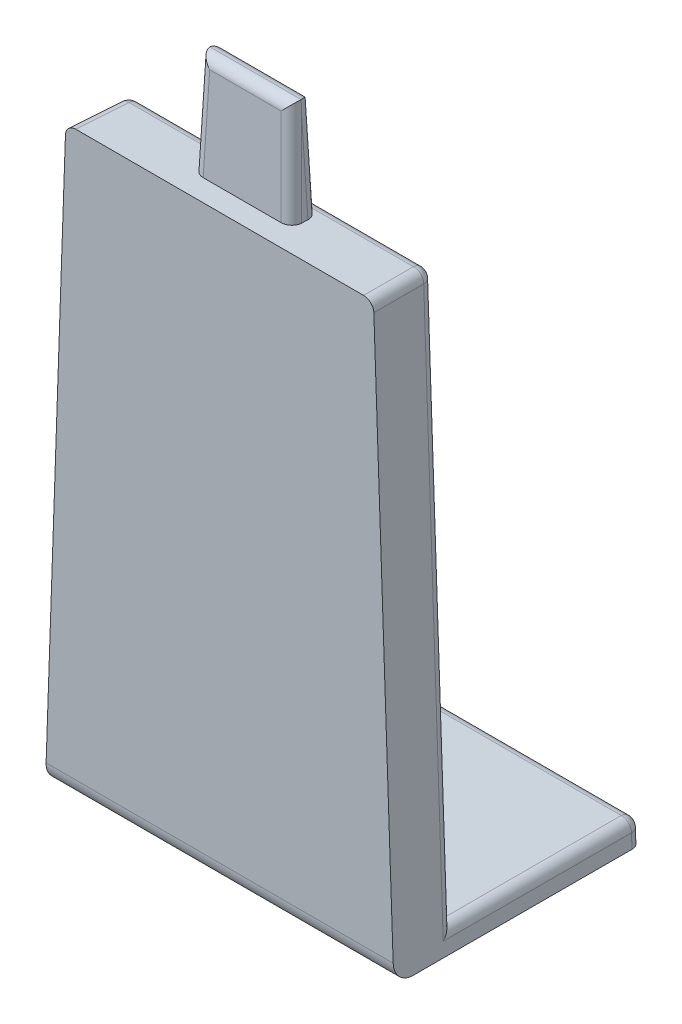
ISO-10303-21;
HEADER;
FILE_DESCRIPTION(('STEP AP214'),'2;1');
FILE_NAME('part.step','',(''),(''),'','','');
FILE_SCHEMA(('AUTOMOTIVE_DESIGN { 1 0 10303 214 1 1 1 1 }'));
ENDSEC;
DATA;
#1=APPLICATION_CONTEXT('core data for automotive mechanical design processes');
#2=APPLICATION_PROTOCOL_DEFINITION('international standard','automotive_design',2000,#1);
#3=PRODUCT_CONTEXT('',#1,'mechanical');
#4=PRODUCT('Part','Part','',(#3));
#5=PRODUCT_RELATED_PRODUCT_CATEGORY('part','',(#4));
#6=PRODUCT_DEFINITION_FORMATION('','',#4);
#7=PRODUCT_DEFINITION_CONTEXT('part definition',#1,'design');
#8=PRODUCT_DEFINITION('design','',#6,#7);
#9=PRODUCT_DEFINITION_SHAPE('','',#8);
#10=(LENGTH_UNIT() NAMED_UNIT(*) SI_UNIT(.MILLI.,.METRE.));
#11=(NAMED_UNIT(*) PLANE_ANGLE_UNIT() SI_UNIT($,.RADIAN.));
#12=(NAMED_UNIT(*) SI_UNIT($,.STERADIAN.) SOLID_ANGLE_UNIT());
#13=UNCERTAINTY_MEASURE_WITH_UNIT(LENGTH_MEASURE(1.E-05),#10,'distance_accuracy_value','');
#14=(GEOMETRIC_REPRESENTATION_CONTEXT(3) GLOBAL_UNCERTAINTY_ASSIGNED_CONTEXT((#13)) GLOBAL_UNIT_ASSIGNED_CONTEXT((#10,
#11,#12)) REPRESENTATION_CONTEXT('',''));
#15=CARTESIAN_POINT('',(0.,0.,0.));
#16=DIRECTION('',(0.,0.,1.));
#17=DIRECTION('',(1.,0.,0.));
#18=AXIS2_PLACEMENT_3D('',#15,#16,#17);
#19=CARTESIAN_POINT('',(0.,6.99999999999998,0.));
#20=DIRECTION('',(0.,0.999390827019096,-0.034899496702501));
#21=DIRECTION('',(0.,0.034899496702501,0.999390827019096));
#22=AXIS2_PLACEMENT_3D('',#19,#20,#21);
#23=PLANE('',#22);
#24=DIRECTION('',(1.,0.,0.));
#25=VECTOR('',#24,1.);
#26=CARTESIAN_POINT('',(0.,6.99999999999998,0.));
#27=LINE('',#26,#25);
#28=CARTESIAN_POINT('',(35.9651005032975,6.99999999999999,0.));
#29=VERTEX_POINT('',#28);
#30=CARTESIAN_POINT('',(64.0444156356728,6.99999999999999,0.));
#31=VERTEX_POINT('',#30);
#32=EDGE_CURVE('E342',#29,#31,#27,.T.);
#33=ORIENTED_EDGE('',*,*,#32,.T.);
#34=DIRECTION('',(0.0336829286285835,0.0348796936521425,0.998823741853253));
#35=VECTOR('',#34,1.);
#36=CARTESIAN_POINT('',(63.8431750098552,6.79160923159958,-5.96753082573548));
#37=LINE('',#36,#35);
#38=CARTESIAN_POINT('',(63.8746257585471,6.82417743526153,-5.0348994967025));
#39=VERTEX_POINT('',#38);
#40=EDGE_CURVE('E408',#31,#39,#37,.F.);
#41=ORIENTED_EDGE('',*,*,#40,.T.);
#42=DIRECTION('',(1.,0.,0.));
#43=VECTOR('',#42,1.);
#44=CARTESIAN_POINT('',(35.2023355706348,6.82417743526152,-5.0348994967025));
#45=LINE('',#44,#43);
#46=CARTESIAN_POINT('',(36.1348903804232,6.82417743526152,-5.0348994967025));
#47=VERTEX_POINT('',#46);
#48=EDGE_CURVE('E405',#39,#47,#45,.F.);
#49=ORIENTED_EDGE('',*,*,#48,.T.);
#50=DIRECTION('',(0.0336829286285835,-0.0348796936521425,-0.998823741853253));
#51=VECTOR('',#50,1.);
#52=CARTESIAN_POINT('',(35.9242966696454,7.04225360666558,1.20998498259275));
#53=LINE('',#52,#51);
#54=EDGE_CURVE('E403',#47,#29,#53,.F.);
#55=ORIENTED_EDGE('',*,*,#54,.T.);
#56=EDGE_LOOP('',(#33,#41,#49,#55));
#57=FACE_BOUND('',#56,.T.);
#58=DIRECTION('',(-1.,0.,0.));
#59=VECTOR('',#58,1.);
#60=CARTESIAN_POINT('',(0.,6.83217565133555,-4.80586055539482));
#61=LINE('',#60,#59);
#62=CARTESIAN_POINT('',(53.8112277978609,6.83217565133556,-4.80586055539482));
#63=VERTEX_POINT('',#62);
#64=CARTESIAN_POINT('',(46.1982883411095,6.83217565133556,-4.80586055539482));
#65=VERTEX_POINT('',#64);
#66=EDGE_CURVE('E280',#63,#65,#61,.T.);
#67=ORIENTED_EDGE('',*,*,#66,.F.);
#68=CARTESIAN_POINT('',(53.8087873873181,6.8671603690521,-3.80402931783288));
#69=DIRECTION('',(0.,0.999390827019096,-0.034899496702501));
#70=DIRECTION('',(0.44743163281964,-0.0312112529470743,-0.893773344669567));
#71=AXIS2_PLACEMENT_3D('',#68,#69,#70);
#72=ELLIPSE('',#71,1.00305218682893,1.);
#73=CARTESIAN_POINT('',(54.8093984196086,6.86711775854508,-3.8052495231043));
#74=VERTEX_POINT('',#73);
#75=EDGE_CURVE('E263',#63,#74,#72,.F.);
#76=ORIENTED_EDGE('',*,*,#75,.T.);
#77=DIRECTION('',(0.00121871637466386,-0.0348994707849106,-0.999390084836412));
#78=VECTOR('',#77,1.);
#79=CARTESIAN_POINT('',(54.804676669644,7.00233098646974,0.0667507189469179));
#80=LINE('',#79,#78);
#81=CARTESIAN_POINT('',(54.8086548471121,6.88841088888891,-3.1954940493922));
#82=VERTEX_POINT('',#81);
#83=EDGE_CURVE('E373',#82,#74,#80,.T.);
#84=ORIENTED_EDGE('',*,*,#83,.F.);
#85=CARTESIAN_POINT('',(53.8080467871803,6.88836838217895,-3.1967112823049));
#86=DIRECTION('',(0.,0.999390827019096,-0.034899496702501));
#87=DIRECTION('',(1.,0.,0.));
#88=AXIS2_PLACEMENT_3D('',#85,#86,#87);
#89=ELLIPSE('',#88,1.00060880211504,1.);
#90=CARTESIAN_POINT('',(53.8080467871803,6.92326787888145,-2.19732045528581));
#91=VERTEX_POINT('',#90);
#92=EDGE_CURVE('E257',#82,#91,#89,.F.);
#93=ORIENTED_EDGE('',*,*,#92,.T.);
#94=DIRECTION('',(1.,0.,0.));
#95=VECTOR('',#94,1.);
#96=CARTESIAN_POINT('',(0.,6.92326787888144,-2.19732045528581));
#97=LINE('',#96,#95);
#98=CARTESIAN_POINT('',(46.2014693517901,6.92326787888145,-2.19732045528581));
#99=VERTEX_POINT('',#98);
#100=EDGE_CURVE('E370',#99,#91,#97,.T.);
#101=ORIENTED_EDGE('',*,*,#100,.F.);
#102=CARTESIAN_POINT('',(46.2014693517901,6.88836838217895,-3.1967112823049));
#103=DIRECTION('',(0.,0.999390827019096,-0.034899496702501));
#104=DIRECTION('',(-1.,0.,0.));
#105=AXIS2_PLACEMENT_3D('',#102,#103,#104);
#106=ELLIPSE('',#105,1.00060880211504,1.);
#107=CARTESIAN_POINT('',(45.2008612918583,6.88841088888891,-3.1954940493922));
#108=VERTEX_POINT('',#107);
#109=EDGE_CURVE('E259',#99,#108,#106,.F.);
#110=ORIENTED_EDGE('',*,*,#109,.T.);
#111=DIRECTION('',(0.00121871637466384,0.0348994707849106,0.999390084836412));
#112=VECTOR('',#111,1.);
#113=CARTESIAN_POINT('',(45.2046909282322,6.99807732607276,-0.0550581775606764));
#114=LINE('',#113,#112);
#115=CARTESIAN_POINT('',(45.2001177193618,6.86711775854508,-3.8052495231043));
#116=VERTEX_POINT('',#115);
#117=EDGE_CURVE('E367',#116,#108,#114,.T.);
#118=ORIENTED_EDGE('',*,*,#117,.F.);
#119=CARTESIAN_POINT('',(46.2007287516523,6.86716036905209,-3.80402931783288));
#120=DIRECTION('',(0.,0.999390827019096,-0.034899496702501));
#121=DIRECTION('',(-0.44743163281964,-0.0312112529470745,-0.893773344669567));
#122=AXIS2_PLACEMENT_3D('',#119,#120,#121);
#123=ELLIPSE('',#122,1.00305218682893,1.);
#124=EDGE_CURVE('E261',#116,#65,#123,.F.);
#125=ORIENTED_EDGE('',*,*,#124,.T.);
#126=EDGE_LOOP('',(#67,#76,#84,#93,#101,#110,#118,#125));
#127=FACE_BOUND('',#126,.T.);
#128=ADVANCED_FACE('F43',(#57,#127),#23,.T.);
#129=CARTESIAN_POINT('',(34.7132232214425,-1.21221246643157,0.));
#130=DIRECTION('',(-0.998782025129912,0.0348782368720625,-0.034899496702501));
#131=DIRECTION('',(-0.0349207435583595,0.,0.999390084836412));
#132=AXIS2_PLACEMENT_3D('',#129,#130,#131);
#133=PLANE('',#132);
#134=DIRECTION('',(-0.0336829286285835,0.0348796936521425,0.998823741853253));
#135=VECTOR('',#134,1.);
#136=CARTESIAN_POINT('',(33.0073766016474,-48.4676276440571,1.59266988578275));
#137=LINE('',#136,#135);
#138=CARTESIAN_POINT('',(33.2308754404686,-48.6990674667535,-5.0348994967025));
#139=VERTEX_POINT('',#138);
#140=CARTESIAN_POINT('',(33.8716047474789,-49.3625620870967,-24.0348994967025));
#141=VERTEX_POINT('',#140);
#142=EDGE_CURVE('E318',#139,#141,#137,.F.);
#143=ORIENTED_EDGE('',*,*,#142,.T.);
#144=DIRECTION('',(0.0348994967025008,0.999390827019096,0.));
#145=VECTOR('',#144,1.);
#146=CARTESIAN_POINT('',(35.5520291171726,-1.24150421376468,-24.0348994967025));
#147=LINE('',#146,#145);
#148=CARTESIAN_POINT('',(33.8236937035321,-50.7345548766064,-24.0348994967025));
#149=VERTEX_POINT('',#148);
#150=EDGE_CURVE('E415',#141,#149,#147,.F.);
#151=ORIENTED_EDGE('',*,*,#150,.T.);
#152=DIRECTION('',(0.0336829286285835,-0.0348796936521425,-0.998823741853253));
#153=VECTOR('',#152,1.);
#154=CARTESIAN_POINT('',(33.8178281499959,-50.7284809181125,-23.8609640828411));
#155=LINE('',#154,#153);
#156=CARTESIAN_POINT('',(33.0782659064143,-49.9626417959488,-1.930201006595));
#157=VERTEX_POINT('',#156);
#158=EDGE_CURVE('E341',#149,#157,#155,.F.);
#159=ORIENTED_EDGE('',*,*,#158,.T.);
#160=CARTESIAN_POINT('',(33.1505038201031,-47.9638601419106,-2.));
#161=DIRECTION('',(-0.998782025129912,0.0348782368720625,-0.034899496702501));
#162=DIRECTION('',(0.0493403108765194,0.706030331734641,-0.70646068849815));
#163=AXIS2_PLACEMENT_3D('',#160,#161,#162);
#164=ELLIPSE('',#163,2.00243892028379,2.);
#165=CARTESIAN_POINT('',(33.0806197096077,-47.9638601419106,0.));
#166=VERTEX_POINT('',#165);
#167=EDGE_CURVE('E90',#157,#166,#164,.T.);
#168=ORIENTED_EDGE('',*,*,#167,.T.);
#169=DIRECTION('',(0.0348994967025008,0.999390827019096,0.));
#170=VECTOR('',#169,1.);
#171=CARTESIAN_POINT('',(34.7132232214425,-1.21221246643157,0.));
#172=LINE('',#171,#170);
#173=CARTESIAN_POINT('',(34.9663184781676,6.03548740985295,0.));
#174=VERTEX_POINT('',#173);
#175=EDGE_CURVE('E351',#166,#174,#172,.T.);
#176=ORIENTED_EDGE('',*,*,#175,.T.);
#177=DIRECTION('',(0.0336829286285835,-0.0348796936521425,-0.998823741853253));
#178=VECTOR('',#177,1.);
#179=CARTESIAN_POINT('',(34.974546293436,6.02696725772629,-0.24398523430801));
#180=LINE('',#179,#178);
#181=CARTESIAN_POINT('',(35.1361083552933,5.85966484511449,-5.0348994967025));
#182=VERTEX_POINT('',#181);
#183=EDGE_CURVE('E410',#174,#182,#180,.T.);
#184=ORIENTED_EDGE('',*,*,#183,.T.);
#185=DIRECTION('',(0.0348994967025008,0.999390827019096,0.));
#186=VECTOR('',#185,1.);
#187=CARTESIAN_POINT('',(33.2634211339777,-47.7670807441584,-5.0348994967025));
#188=LINE('',#187,#186);
#189=EDGE_CURVE('E412',#182,#139,#188,.F.);
#190=ORIENTED_EDGE('',*,*,#189,.T.);
#191=EDGE_LOOP('',(#143,#151,#159,#168,#176,#184,#190));
#192=FACE_BOUND('',#191,.T.);
#193=ADVANCED_FACE('F424',(#192),#133,.T.);
#194=CARTESIAN_POINT('',(65.174483840101,2.27594312692383,0.));
#195=DIRECTION('',(0.998782025129912,0.0348782368720631,-0.034899496702501));
#196=DIRECTION('',(-0.0349207435583595,0.,-0.999390084836412));
#197=AXIS2_PLACEMENT_3D('',#194,#195,#196);
#198=PLANE('',#197);
#199=DIRECTION('',(0.0336829286285835,0.0348796936521425,0.998823741853253));
#200=VECTOR('',#199,1.);
#201=CARTESIAN_POINT('',(66.0782232244374,-50.8459771213378,-27.225615118181));
#202=LINE('',#201,#200);
#203=CARTESIAN_POINT('',(66.1858224354383,-50.7345548766064,-24.0348994967025));
#204=VERTEX_POINT('',#203);
#205=CARTESIAN_POINT('',(66.9312502325561,-49.9626417959488,-1.930201006595));
#206=VERTEX_POINT('',#205);
#207=EDGE_CURVE('E218',#204,#206,#202,.T.);
#208=ORIENTED_EDGE('',*,*,#207,.F.);
#209=DIRECTION('',(-0.0348994967025014,0.999390827019096,0.));
#210=VECTOR('',#209,1.);
#211=CARTESIAN_POINT('',(66.1053656979824,-48.4305753645016,-24.0348994967025));
#212=LINE('',#211,#210);
#213=CARTESIAN_POINT('',(66.1379113914915,-49.3625620870967,-24.0348994967025));
#214=VERTEX_POINT('',#213);
#215=EDGE_CURVE('E211',#204,#214,#212,.T.);
#216=ORIENTED_EDGE('',*,*,#215,.T.);
#217=DIRECTION('',(0.0336829286285835,0.0348796936521425,0.998823741853253));
#218=VECTOR('',#217,1.);
#219=CARTESIAN_POINT('',(66.7471899498098,-48.7316356704154,-5.96753082573548));
#220=LINE('',#219,#218);
#221=CARTESIAN_POINT('',(66.7786406985018,-48.6990674667535,-5.0348994967025));
#222=VERTEX_POINT('',#221);
#223=EDGE_CURVE('E215',#214,#222,#220,.T.);
#224=ORIENTED_EDGE('',*,*,#223,.T.);
#225=DIRECTION('',(-0.0348994967025014,0.999390827019096,0.));
#226=VECTOR('',#225,1.);
#227=CARTESIAN_POINT('',(64.9987683817184,2.26980700790551,-5.0348994967025));
#228=LINE('',#227,#226);
#229=CARTESIAN_POINT('',(64.8734077836771,5.85966484511449,-5.0348994967025));
#230=VERTEX_POINT('',#229);
#231=EDGE_CURVE('E62',#222,#230,#228,.T.);
#232=ORIENTED_EDGE('',*,*,#231,.T.);
#233=DIRECTION('',(-0.0336829286285835,-0.0348796936521425,-0.998823741853253));
#234=VECTOR('',#233,1.);
#235=CARTESIAN_POINT('',(65.0442926056199,6.03662125840304,0.0324691742645241));
#236=LINE('',#235,#234);
#237=CARTESIAN_POINT('',(65.0431976608028,6.03548740985296,0.));
#238=VERTEX_POINT('',#237);
#239=EDGE_CURVE('E222',#230,#238,#236,.F.);
#240=ORIENTED_EDGE('',*,*,#239,.T.);
#241=DIRECTION('',(-0.0348994967025014,0.999390827019096,0.));
#242=VECTOR('',#241,1.);
#243=CARTESIAN_POINT('',(65.174483840101,2.27594312692383,0.));
#244=LINE('',#243,#242);
#245=CARTESIAN_POINT('',(66.9288964293627,-47.9638601419106,0.));
#246=VERTEX_POINT('',#245);
#247=EDGE_CURVE('E346',#246,#238,#244,.T.);
#248=ORIENTED_EDGE('',*,*,#247,.F.);
#249=CARTESIAN_POINT('',(66.8590123188673,-47.9638601419106,-2.));
#250=DIRECTION('',(0.998782025129912,0.0348782368720631,-0.034899496702501));
#251=DIRECTION('',(0.0493403108765198,-0.706030331734647,0.706460688498145));
#252=AXIS2_PLACEMENT_3D('',#249,#250,#251);
#253=ELLIPSE('',#252,2.00243892028379,2.);
#254=EDGE_CURVE('E358',#246,#206,#253,.T.);
#255=ORIENTED_EDGE('',*,*,#254,.T.);
#256=EDGE_LOOP('',(#208,#216,#224,#232,#240,#248,#255));
#257=FACE_BOUND('',#256,.T.);
#258=ADVANCED_FACE('F213',(#257),#198,.T.);
#259=CARTESIAN_POINT('',(0.,-50.7682569288185,-25.));
#260=DIRECTION('',(0.,-0.999390827019096,0.034899496702501));
#261=DIRECTION('',(0.,-0.034899496702501,-0.999390827019096));
#262=AXIS2_PLACEMENT_3D('',#259,#260,#261);
#263=PLANE('',#262);
#264=ORIENTED_EDGE('',*,*,#158,.F.);
#265=CARTESIAN_POINT('',(34.8237362620773,-50.7333361593267,-24.));
#266=DIRECTION('',(0.,-0.999390827019096,0.034899496702501));
#267=DIRECTION('',(-0.707322189149585,-0.0246701508580254,-0.706460688498151));
#268=AXIS2_PLACEMENT_3D('',#265,#266,#267);
#269=ELLIPSE('',#268,1.0012194601419,1.);
#270=CARTESIAN_POINT('',(34.8225168019354,-50.7682569288185,-25.));
#271=VERTEX_POINT('',#270);
#272=EDGE_CURVE('E246',#149,#271,#269,.T.);
#273=ORIENTED_EDGE('',*,*,#272,.T.);
#274=DIRECTION('',(1.,0.,0.));
#275=VECTOR('',#274,1.);
#276=CARTESIAN_POINT('',(0.,-50.7682569288185,-25.));
#277=LINE('',#276,#275);
#278=CARTESIAN_POINT('',(65.186999337035,-50.7682569288185,-25.));
#279=VERTEX_POINT('',#278);
#280=EDGE_CURVE('E338',#271,#279,#277,.T.);
#281=ORIENTED_EDGE('',*,*,#280,.T.);
#282=CARTESIAN_POINT('',(65.1857798768931,-50.7333361593267,-24.));
#283=DIRECTION('',(0.,-0.999390827019096,0.034899496702501));
#284=DIRECTION('',(0.707322189149591,-0.0246701508580252,-0.706460688498145));
#285=AXIS2_PLACEMENT_3D('',#282,#283,#284);
#286=ELLIPSE('',#285,1.0012194601419,1.);
#287=EDGE_CURVE('E249',#279,#204,#286,.T.);
#288=ORIENTED_EDGE('',*,*,#287,.T.);
#289=ORIENTED_EDGE('',*,*,#207,.T.);
#290=DIRECTION('',(1.,0.,0.));
#291=VECTOR('',#290,1.);
#292=CARTESIAN_POINT('',(0.,-49.9626417959488,-1.930201006595));
#293=LINE('',#292,#291);
#294=EDGE_CURVE('E359',#206,#157,#293,.F.);
#295=ORIENTED_EDGE('',*,*,#294,.T.);
#296=EDGE_LOOP('',(#264,#273,#281,#288,#289,#295));
#297=FACE_BOUND('',#296,.T.);
#298=ADVANCED_FACE('F335',(#297),#263,.T.);
#299=CARTESIAN_POINT('',(0.,0.,-25.));
#300=DIRECTION('',(0.,0.,1.));
#301=DIRECTION('',(1.,0.,0.));
#302=AXIS2_PLACEMENT_3D('',#299,#300,#301);
#303=PLANE('',#302);
#304=ORIENTED_EDGE('',*,*,#280,.F.);
#305=DIRECTION('',(-0.0348994967025008,-0.999390827019096,0.));
#306=VECTOR('',#305,1.);
#307=CARTESIAN_POINT('',(36.5508111423025,-1.27638245063674,-25.));
#308=LINE('',#307,#306);
#309=CARTESIAN_POINT('',(34.8703867726089,-49.3974403239687,-25.));
#310=VERTEX_POINT('',#309);
#311=EDGE_CURVE('E331',#271,#310,#308,.F.);
#312=ORIENTED_EDGE('',*,*,#311,.T.);
#313=DIRECTION('',(-1.,0.,0.));
#314=VECTOR('',#313,1.);
#315=CARTESIAN_POINT('',(0.,-49.3974403239687,-25.));
#316=LINE('',#315,#314);
#317=CARTESIAN_POINT('',(65.1391293663616,-49.3974403239687,-25.));
#318=VERTEX_POINT('',#317);
#319=EDGE_CURVE('E322',#310,#318,#316,.F.);
#320=ORIENTED_EDGE('',*,*,#319,.T.);
#321=DIRECTION('',(-0.0348994967025014,0.999390827019096,0.));
#322=VECTOR('',#321,1.);
#323=CARTESIAN_POINT('',(65.1881762386317,-50.8019589810305,-25.));
#324=LINE('',#323,#322);
#325=EDGE_CURVE('E229',#318,#279,#324,.F.);
#326=ORIENTED_EDGE('',*,*,#325,.T.);
#327=EDGE_LOOP('',(#304,#312,#320,#326));
#328=FACE_BOUND('',#327,.T.);
#329=ADVANCED_FACE('F423',(#328),#303,.F.);
#330=CARTESIAN_POINT('',(0.,0.,0.));
#331=DIRECTION('',(0.,0.,1.));
#332=DIRECTION('',(1.,0.,0.));
#333=AXIS2_PLACEMENT_3D('',#330,#331,#332);
#334=PLANE('',#333);
#335=ORIENTED_EDGE('',*,*,#247,.T.);
#336=CARTESIAN_POINT('',(64.0432387340762,5.99939045570117,0.));
#337=DIRECTION('',(0.,0.,1.));
#338=DIRECTION('',(0.694658370458997,0.719339800338651,0.));
#339=AXIS2_PLACEMENT_3D('',#336,#337,#338);
#340=ELLIPSE('',#339,1.00117764335934,1.);
#341=EDGE_CURVE('E255',#238,#31,#340,.T.);
#342=ORIENTED_EDGE('',*,*,#341,.T.);
#343=ORIENTED_EDGE('',*,*,#32,.F.);
#344=CARTESIAN_POINT('',(35.9662774048942,5.99939045570116,0.));
#345=DIRECTION('',(0.,0.,1.));
#346=DIRECTION('',(-0.694658370458997,0.719339800338651,0.));
#347=AXIS2_PLACEMENT_3D('',#344,#345,#346);
#348=ELLIPSE('',#347,1.00117764335934,1.);
#349=EDGE_CURVE('E221',#29,#174,#348,.T.);
#350=ORIENTED_EDGE('',*,*,#349,.T.);
#351=ORIENTED_EDGE('',*,*,#175,.F.);
#352=DIRECTION('',(1.,0.,0.));
#353=VECTOR('',#352,1.);
#354=CARTESIAN_POINT('',(0.,-47.9638601419106,0.));
#355=LINE('',#354,#353);
#356=EDGE_CURVE('E355',#166,#246,#355,.T.);
#357=ORIENTED_EDGE('',*,*,#356,.T.);
#358=EDGE_LOOP('',(#335,#342,#343,#350,#351,#357));
#359=FACE_BOUND('',#358,.T.);
#360=ADVANCED_FACE('F431',(#359),#334,.T.);
#361=CARTESIAN_POINT('',(0.,0.,-6.));
#362=DIRECTION('',(0.,0.,-1.));
#363=DIRECTION('',(-1.,0.,0.));
#364=AXIS2_PLACEMENT_3D('',#361,#362,#363);
#365=PLANE('',#364);
#366=DIRECTION('',(-1.,0.,0.));
#367=VECTOR('',#366,1.);
#368=CARTESIAN_POINT('',(32.9826880158487,-47.7682569288185,-6.));
#369=LINE('',#368,#367);
#370=CARTESIAN_POINT('',(65.7461360782661,-47.7682569288185,-6.));
#371=VERTEX_POINT('',#370);
#372=CARTESIAN_POINT('',(34.2633800607043,-47.7682569288185,-6.));
#373=VERTEX_POINT('',#372);
#374=EDGE_CURVE('E350',#371,#373,#369,.T.);
#375=ORIENTED_EDGE('',*,*,#374,.T.);
#376=DIRECTION('',(-0.0348994967025008,-0.999390827019096,0.));
#377=VECTOR('',#376,1.);
#378=CARTESIAN_POINT('',(36.1674360739324,6.75677333083747,-6.));
#379=LINE('',#378,#377);
#380=CARTESIAN_POINT('',(36.1348903804232,5.82478660824242,-6.));
#381=VERTEX_POINT('',#380);
#382=EDGE_CURVE('E401',#373,#381,#379,.F.);
#383=ORIENTED_EDGE('',*,*,#382,.T.);
#384=DIRECTION('',(-1.,0.,0.));
#385=VECTOR('',#384,1.);
#386=CARTESIAN_POINT('',(64.8071805683355,5.82478660824243,-6.));
#387=LINE('',#386,#385);
#388=CARTESIAN_POINT('',(63.8746257585471,5.82478660824243,-6.));
#389=VERTEX_POINT('',#388);
#390=EDGE_CURVE('E398',#381,#389,#387,.F.);
#391=ORIENTED_EDGE('',*,*,#390,.T.);
#392=DIRECTION('',(-0.0348994967025014,0.999390827019096,0.));
#393=VECTOR('',#392,1.);
#394=CARTESIAN_POINT('',(63.9999863565885,2.23492877103345,-6.));
#395=LINE('',#394,#393);
#396=EDGE_CURVE('E396',#389,#371,#395,.F.);
#397=ORIENTED_EDGE('',*,*,#396,.T.);
#398=EDGE_LOOP('',(#375,#383,#391,#397));
#399=FACE_BOUND('',#398,.T.);
#400=ADVANCED_FACE('F465',(#399),#365,.T.);
#401=CARTESIAN_POINT('',(32.9826880158487,-47.7682569288185,-6.));
#402=DIRECTION('',(0.,0.999390827019096,-0.034899496702501));
#403=DIRECTION('',(0.,0.034899496702501,0.999390827019096));
#404=AXIS2_PLACEMENT_3D('',#401,#402,#403);
#405=PLANE('',#404);
#406=DIRECTION('',(1.,0.,0.));
#407=VECTOR('',#406,1.);
#408=CARTESIAN_POINT('',(32.9826880158487,-48.3980494969496,-24.0348994967025));
#409=LINE('',#408,#407);
#410=CARTESIAN_POINT('',(65.1391293663616,-48.3980494969496,-24.0348994967025));
#411=VERTEX_POINT('',#410);
#412=CARTESIAN_POINT('',(34.8703867726089,-48.3980494969496,-24.0348994967025));
#413=VERTEX_POINT('',#412);
#414=EDGE_CURVE('E323',#411,#413,#409,.F.);
#415=ORIENTED_EDGE('',*,*,#414,.T.);
#416=DIRECTION('',(-0.0336829286285835,0.0348796936521425,0.998823741853253));
#417=VECTOR('',#416,1.);
#418=CARTESIAN_POINT('',(34.2607514984052,-47.7667536901557,-5.95695287690906));
#419=LINE('',#418,#417);
#420=CARTESIAN_POINT('',(34.2622031591076,-47.7682569288185,-6.));
#421=VERTEX_POINT('',#420);
#422=EDGE_CURVE('E319',#413,#421,#419,.T.);
#423=ORIENTED_EDGE('',*,*,#422,.T.);
#424=CARTESIAN_POINT('',(34.2645995208462,-47.7333361593267,-5.));
#425=DIRECTION('',(0.,0.999390827019096,-0.034899496702501));
#426=DIRECTION('',(0.707322189149585,0.0246701508580254,0.706460688498151));
#427=AXIS2_PLACEMENT_3D('',#424,#425,#426);
#428=ELLIPSE('',#427,1.0012194601419,1.);
#429=EDGE_CURVE('E53',#421,#373,#428,.F.);
#430=ORIENTED_EDGE('',*,*,#429,.T.);
#431=ORIENTED_EDGE('',*,*,#374,.F.);
#432=CARTESIAN_POINT('',(65.7449166181242,-47.7333361593267,-5.));
#433=DIRECTION('',(0.,0.999390827019096,-0.034899496702501));
#434=DIRECTION('',(-0.707322189149591,0.0246701508580252,0.706460688498145));
#435=AXIS2_PLACEMENT_3D('',#432,#433,#434);
#436=ELLIPSE('',#435,1.0012194601419,1.);
#437=CARTESIAN_POINT('',(65.7473129798628,-47.7682569288185,-6.));
#438=VERTEX_POINT('',#437);
#439=EDGE_CURVE('E11',#371,#438,#436,.F.);
#440=ORIENTED_EDGE('',*,*,#439,.T.);
#441=DIRECTION('',(-0.0336829286285835,-0.0348796936521425,-0.998823741853253));
#442=VECTOR('',#441,1.);
#443=CARTESIAN_POINT('',(65.1076786176696,-48.4306177006116,-24.9675308257355));
#444=LINE('',#443,#442);
#445=EDGE_CURVE('E326',#438,#411,#444,.T.);
#446=ORIENTED_EDGE('',*,*,#445,.T.);
#447=EDGE_LOOP('',(#415,#423,#430,#431,#440,#446));
#448=FACE_BOUND('',#447,.T.);
#449=ADVANCED_FACE('F417',(#448),#405,.T.);
#450=CARTESIAN_POINT('',(0.,6.99999999999998,-4.8));
#451=DIRECTION('',(0.,0.034899496702501,-0.999390827019096));
#452=DIRECTION('',(0.,0.999390827019096,0.034899496702501));
#453=AXIS2_PLACEMENT_3D('',#450,#451,#452);
#454=PLANE('',#453);
#455=ORIENTED_EDGE('',*,*,#66,.T.);
#456=DIRECTION('',(0.0348782627423745,0.998782765958718,0.0348782627423747));
#457=VECTOR('',#456,1.);
#458=CARTESIAN_POINT('',(46.1479418630089,5.39044115254378,-4.85620703349542));
#459=LINE('',#458,#457);
#460=CARTESIAN_POINT('',(46.5196545392097,16.0348994967025,-4.48449435729455));
#461=VERTEX_POINT('',#460);
#462=EDGE_CURVE('E386',#65,#461,#459,.T.);
#463=ORIENTED_EDGE('',*,*,#462,.T.);
#464=DIRECTION('',(-1.,0.,0.));
#465=VECTOR('',#464,1.);
#466=CARTESIAN_POINT('',(54.4555503745677,16.0348994967025,-4.48449435729455));
#467=LINE('',#466,#465);
#468=CARTESIAN_POINT('',(53.4898615997606,16.0348994967025,-4.48449435729455));
#469=VERTEX_POINT('',#468);
#470=EDGE_CURVE('E384',#461,#469,#467,.F.);
#471=ORIENTED_EDGE('',*,*,#470,.T.);
#472=DIRECTION('',(-0.0348782627423749,0.998782765958718,0.0348782627423747));
#473=VECTOR('',#472,1.);
#474=CARTESIAN_POINT('',(53.7399133784504,8.87435342829771,-4.73454613598435));
#475=LINE('',#474,#473);
#476=EDGE_CURVE('E382',#469,#63,#475,.F.);
#477=ORIENTED_EDGE('',*,*,#476,.T.);
#478=EDGE_LOOP('',(#455,#463,#471,#477));
#479=FACE_BOUND('',#478,.T.);
#480=ADVANCED_FACE('F472',(#479),#454,.T.);
#481=CARTESIAN_POINT('',(45.2047580694852,6.99999999999999,0.));
#482=DIRECTION('',(-0.999390827019096,0.0348994967025008,0.));
#483=DIRECTION('',(-0.0348994967025008,-0.999390827019096,0.));
#484=AXIS2_PLACEMENT_3D('',#481,#482,#483);
#485=PLANE('',#484);
#486=ORIENTED_EDGE('',*,*,#117,.T.);
#487=DIRECTION('',(0.0348782627423745,0.998782765958718,-0.0348782627423747));
#488=VECTOR('',#487,1.);
#489=CARTESIAN_POINT('',(45.2008660322618,6.8885466362851,-3.19549878979573));
#490=LINE('',#489,#488);
#491=CARTESIAN_POINT('',(45.5053672424661,15.608320416649,-3.5));
#492=VERTEX_POINT('',#491);
#493=EDGE_CURVE('E394',#108,#492,#490,.T.);
#494=ORIENTED_EDGE('',*,*,#493,.T.);
#495=DIRECTION('',(0.0348782627423745,0.998782765958718,0.0348782627423747));
#496=VECTOR('',#495,1.);
#497=CARTESIAN_POINT('',(45.2093814847453,7.13239729042075,-3.79598575772079));
#498=LINE('',#497,#496);
#499=EDGE_CURVE('E392',#492,#116,#498,.F.);
#500=ORIENTED_EDGE('',*,*,#499,.T.);
#501=EDGE_LOOP('',(#486,#494,#500));
#502=FACE_BOUND('',#501,.T.);
#503=ADVANCED_FACE('F583',(#502),#485,.T.);
#504=CARTESIAN_POINT('',(0.,6.99999999999998,-2.2));
#505=DIRECTION('',(0.,0.034899496702501,0.999390827019096));
#506=DIRECTION('',(0.,-0.999390827019096,0.034899496702501));
#507=AXIS2_PLACEMENT_3D('',#504,#505,#506);
#508=PLANE('',#507);
#509=ORIENTED_EDGE('',*,*,#100,.T.);
#510=DIRECTION('',(-0.0348782627423749,0.998782765958718,-0.0348782627423747));
#511=VECTOR('',#510,1.);
#512=CARTESIAN_POINT('',(53.7399133784504,8.87435342829771,-2.26545386401565));
#513=LINE('',#512,#511);
#514=CARTESIAN_POINT('',(53.4898615997606,16.0348994967025,-2.51550564270546));
#515=VERTEX_POINT('',#514);
#516=EDGE_CURVE('E380',#91,#515,#513,.T.);
#517=ORIENTED_EDGE('',*,*,#516,.T.);
#518=DIRECTION('',(1.,0.,0.));
#519=VECTOR('',#518,1.);
#520=CARTESIAN_POINT('',(45.5539657644026,16.0348994967025,-2.51550564270546));
#521=LINE('',#520,#519);
#522=CARTESIAN_POINT('',(46.5196545392097,16.0348994967025,-2.51550564270546));
#523=VERTEX_POINT('',#522);
#524=EDGE_CURVE('E377',#515,#523,#521,.F.);
#525=ORIENTED_EDGE('',*,*,#524,.T.);
#526=DIRECTION('',(0.0348782627423745,0.998782765958718,-0.0348782627423747));
#527=VECTOR('',#526,1.);
#528=CARTESIAN_POINT('',(46.1479418630089,5.39044115254378,-2.14379296650458));
#529=LINE('',#528,#527);
#530=EDGE_CURVE('E362',#523,#99,#529,.F.);
#531=ORIENTED_EDGE('',*,*,#530,.T.);
#532=EDGE_LOOP('',(#509,#517,#525,#531));
#533=FACE_BOUND('',#532,.T.);
#534=ADVANCED_FACE('F575',(#533),#508,.T.);
#535=CARTESIAN_POINT('',(54.8047580694852,6.99999999999999,0.));
#536=DIRECTION('',(0.999390827019096,0.0348994967025012,0.));
#537=DIRECTION('',(-0.0348994967025012,0.999390827019096,0.));
#538=AXIS2_PLACEMENT_3D('',#535,#536,#537);
#539=PLANE('',#538);
#540=DIRECTION('',(-0.0348782627423749,0.998782765958718,0.0348782627423747));
#541=VECTOR('',#540,1.);
#542=CARTESIAN_POINT('',(54.8001346542251,7.13239729042075,-3.79598575772079));
#543=LINE('',#542,#541);
#544=CARTESIAN_POINT('',(54.5041488965043,15.608320416649,-3.5));
#545=VERTEX_POINT('',#544);
#546=EDGE_CURVE('E388',#74,#545,#543,.T.);
#547=ORIENTED_EDGE('',*,*,#546,.T.);
#548=DIRECTION('',(-0.0348782627423749,0.998782765958718,-0.0348782627423747));
#549=VECTOR('',#548,1.);
#550=CARTESIAN_POINT('',(54.8086501067086,6.8885466362851,-3.19549878979573));
#551=LINE('',#550,#549);
#552=EDGE_CURVE('E390',#545,#82,#551,.F.);
#553=ORIENTED_EDGE('',*,*,#552,.T.);
#554=ORIENTED_EDGE('',*,*,#83,.T.);
#555=EDGE_LOOP('',(#547,#553,#554));
#556=FACE_BOUND('',#555,.T.);
#557=ADVANCED_FACE('F568',(#556),#539,.T.);
#558=CARTESIAN_POINT('',(0.,-47.9638601419106,-2.));
#559=DIRECTION('',(1.,0.,0.));
#560=DIRECTION('',(0.,0.,-1.));
#561=AXIS2_PLACEMENT_3D('',#558,#559,#560);
#562=CYLINDRICAL_SURFACE('',#561,2.);
#563=ORIENTED_EDGE('',*,*,#167,.F.);
#564=ORIENTED_EDGE('',*,*,#294,.F.);
#565=ORIENTED_EDGE('',*,*,#254,.F.);
#566=ORIENTED_EDGE('',*,*,#356,.F.);
#567=EDGE_LOOP('',(#563,#564,#565,#566));
#568=FACE_BOUND('',#567,.T.);
#569=ADVANCED_FACE('F428',(#568),#562,.T.);
#570=CARTESIAN_POINT('',(46.2087723117644,7.09749779371825,-3.79598575772079));
#571=DIRECTION('',(-0.0348782627423745,-0.998782765958718,-0.0348782627423747));
#572=DIRECTION('',(0.,0.034899496702501,-0.999390827019096));
#573=AXIS2_PLACEMENT_3D('',#570,#571,#572);
#574=CYLINDRICAL_SURFACE('',#573,1.);
#575=ORIENTED_EDGE('',*,*,#124,.F.);
#576=ORIENTED_EDGE('',*,*,#499,.F.);
#577=CARTESIAN_POINT('',(46.5047580694852,15.5734209199465,-3.5));
#578=DIRECTION('',(0.,0.,1.));
#579=DIRECTION('',(-0.0348994967025008,-0.999390827019096,0.));
#580=AXIS2_PLACEMENT_3D('',#577,#578,#579);
#581=ELLIPSE('',#580,28.6711527860888,1.);
#582=CARTESIAN_POINT('',(45.5551426585271,16.999889041439,-3.50000000000007));
#583=VERTEX_POINT('',#582);
#584=EDGE_CURVE('E81',#583,#492,#581,.T.);
#585=ORIENTED_EDGE('',*,*,#584,.F.);
#586=CARTESIAN_POINT('',(46.5196545392097,16.,-3.48510353027545));
#587=DIRECTION('',(-0.719332420631231,-0.694242840523066,-0.0242434942052022));
#588=DIRECTION('',(0.694666012288505,-0.718894222756295,-0.0251043394418217));
#589=AXIS2_PLACEMENT_3D('',#586,#587,#588);
#590=ELLIPSE('',#589,1.39017785285206,1.);
#591=EDGE_CURVE('E277',#461,#583,#590,.F.);
#592=ORIENTED_EDGE('',*,*,#591,.F.);
#593=ORIENTED_EDGE('',*,*,#462,.F.);
#594=EDGE_LOOP('',(#575,#576,#585,#592,#593));
#595=FACE_BOUND('',#594,.T.);
#596=ADVANCED_FACE('F504',(#595),#574,.T.);
#597=CARTESIAN_POINT('',(53.7399133784504,8.83945393159521,-3.73515530896526));
#598=DIRECTION('',(0.0348782627423749,-0.998782765958718,-0.0348782627423747));
#599=DIRECTION('',(0.999390827019096,0.0348994967025012,0.));
#600=AXIS2_PLACEMENT_3D('',#597,#598,#599);
#601=CYLINDRICAL_SURFACE('',#600,1.);
#602=ORIENTED_EDGE('',*,*,#75,.F.);
#603=ORIENTED_EDGE('',*,*,#476,.F.);
#604=CARTESIAN_POINT('',(53.4898615997606,16.,-3.48510353027545));
#605=DIRECTION('',(0.719332420631232,-0.694242840523066,-0.0242434942052022));
#606=DIRECTION('',(-0.694666012288504,-0.718894222756295,-0.0251043394418217));
#607=AXIS2_PLACEMENT_3D('',#604,#605,#606);
#608=ELLIPSE('',#607,1.39017785285206,1.);
#609=CARTESIAN_POINT('',(54.4543734804433,16.999889041439,-3.50000000000038));
#610=VERTEX_POINT('',#609);
#611=EDGE_CURVE('E73',#610,#469,#608,.F.);
#612=ORIENTED_EDGE('',*,*,#611,.F.);
#613=CARTESIAN_POINT('',(53.5047580694852,15.5734209199464,-3.5));
#614=DIRECTION('',(0.,0.,1.));
#615=DIRECTION('',(0.0348994967025012,-0.999390827019096,0.));
#616=AXIS2_PLACEMENT_3D('',#613,#614,#615);
#617=ELLIPSE('',#616,28.6711527860895,1.);
#618=EDGE_CURVE('E274',#545,#610,#617,.T.);
#619=ORIENTED_EDGE('',*,*,#618,.F.);
#620=ORIENTED_EDGE('',*,*,#546,.F.);
#621=EDGE_LOOP('',(#602,#603,#612,#619,#620));
#622=FACE_BOUND('',#621,.T.);
#623=ADVANCED_FACE('F500',(#622),#601,.T.);
#624=CARTESIAN_POINT('',(46.1479418630089,5.35554165584128,-3.14318379352368));
#625=DIRECTION('',(-0.0348782627423745,-0.998782765958718,0.0348782627423747));
#626=DIRECTION('',(0.,-0.034899496702501,-0.999390827019096));
#627=AXIS2_PLACEMENT_3D('',#624,#625,#626);
#628=CYLINDRICAL_SURFACE('',#627,1.);
#629=ORIENTED_EDGE('',*,*,#109,.F.);
#630=ORIENTED_EDGE('',*,*,#530,.F.);
#631=CARTESIAN_POINT('',(46.5196545392097,16.,-3.51489646972455));
#632=DIRECTION('',(-0.719332420631231,-0.694242840523066,0.0242434942052022));
#633=DIRECTION('',(0.694666012288505,-0.718894222756295,0.0251043394418217));
#634=AXIS2_PLACEMENT_3D('',#631,#632,#633);
#635=ELLIPSE('',#634,1.39017785285206,1.);
#636=EDGE_CURVE('E272',#583,#523,#635,.F.);
#637=ORIENTED_EDGE('',*,*,#636,.F.);
#638=ORIENTED_EDGE('',*,*,#584,.T.);
#639=ORIENTED_EDGE('',*,*,#493,.F.);
#640=EDGE_LOOP('',(#629,#630,#637,#638,#639));
#641=FACE_BOUND('',#640,.T.);
#642=ADVANCED_FACE('F496',(#641),#628,.T.);
#643=CARTESIAN_POINT('',(0.,16.,-3.48510353027545));
#644=DIRECTION('',(-1.,0.,0.));
#645=DIRECTION('',(0.,-1.,0.));
#646=AXIS2_PLACEMENT_3D('',#643,#644,#645);
#647=CYLINDRICAL_SURFACE('',#646,1.);
#648=ORIENTED_EDGE('',*,*,#470,.F.);
#649=ORIENTED_EDGE('',*,*,#591,.T.);
#650=DIRECTION('',(-1.,0.,0.));
#651=VECTOR('',#650,1.);
#652=CARTESIAN_POINT('',(50.0047580694852,16.999889041439,-3.5));
#653=LINE('',#652,#651);
#654=EDGE_CURVE('E269',#610,#583,#653,.T.);
#655=ORIENTED_EDGE('',*,*,#654,.F.);
#656=ORIENTED_EDGE('',*,*,#611,.T.);
#657=EDGE_LOOP('',(#648,#649,#655,#656));
#658=FACE_BOUND('',#657,.T.);
#659=ADVANCED_FACE('F492',(#658),#647,.T.);
#660=CARTESIAN_POINT('',(53.8092592796895,6.8536471395826,-3.19549878979573));
#661=DIRECTION('',(0.0348782627423749,-0.998782765958718,0.0348782627423747));
#662=DIRECTION('',(0.999390827019096,0.0348994967025012,0.));
#663=AXIS2_PLACEMENT_3D('',#660,#661,#662);
#664=CYLINDRICAL_SURFACE('',#663,1.);
#665=ORIENTED_EDGE('',*,*,#552,.F.);
#666=ORIENTED_EDGE('',*,*,#618,.T.);
#667=CARTESIAN_POINT('',(53.4898615997606,16.,-3.51489646972455));
#668=DIRECTION('',(0.719332420631232,-0.694242840523066,0.0242434942052022));
#669=DIRECTION('',(-0.694666012288504,-0.718894222756295,0.0251043394418217));
#670=AXIS2_PLACEMENT_3D('',#667,#668,#669);
#671=ELLIPSE('',#670,1.39017785285206,1.);
#672=EDGE_CURVE('E266',#515,#610,#671,.F.);
#673=ORIENTED_EDGE('',*,*,#672,.F.);
#674=ORIENTED_EDGE('',*,*,#516,.F.);
#675=ORIENTED_EDGE('',*,*,#92,.F.);
#676=EDGE_LOOP('',(#665,#666,#673,#674,#675));
#677=FACE_BOUND('',#676,.T.);
#678=ADVANCED_FACE('F488',(#677),#664,.T.);
#679=CARTESIAN_POINT('',(0.,16.,-3.51489646972455));
#680=DIRECTION('',(1.,0.,0.));
#681=DIRECTION('',(0.,1.,0.));
#682=AXIS2_PLACEMENT_3D('',#679,#680,#681);
#683=CYLINDRICAL_SURFACE('',#682,1.);
#684=ORIENTED_EDGE('',*,*,#636,.T.);
#685=ORIENTED_EDGE('',*,*,#524,.F.);
#686=ORIENTED_EDGE('',*,*,#672,.T.);
#687=ORIENTED_EDGE('',*,*,#654,.T.);
#688=EDGE_LOOP('',(#684,#685,#686,#687));
#689=FACE_BOUND('',#688,.T.);
#690=ADVANCED_FACE('F485',(#689),#683,.T.);
#691=CARTESIAN_POINT('',(36.5508111423025,-1.27638245063674,-24.));
#692=DIRECTION('',(-0.0348994967025008,-0.999390827019096,0.));
#693=DIRECTION('',(0.999390827019096,-0.0348994967025008,0.));
#694=AXIS2_PLACEMENT_3D('',#691,#692,#693);
#695=CYLINDRICAL_SURFACE('',#694,1.);
#696=ORIENTED_EDGE('',*,*,#272,.F.);
#697=ORIENTED_EDGE('',*,*,#150,.F.);
#698=CARTESIAN_POINT('',(34.8703867726089,-49.3974403239687,-24.));
#699=DIRECTION('',(0.0348994967025108,0.999390827019095,0.));
#700=DIRECTION('',(-0.999390827019095,0.0348994967025108,0.));
#701=AXIS2_PLACEMENT_3D('',#698,#699,#700);
#702=CIRCLE('',#701,1.);
#703=EDGE_CURVE('E47',#310,#141,#702,.T.);
#704=ORIENTED_EDGE('',*,*,#703,.F.);
#705=ORIENTED_EDGE('',*,*,#311,.F.);
#706=EDGE_LOOP('',(#696,#697,#704,#705));
#707=FACE_BOUND('',#706,.T.);
#708=ADVANCED_FACE('F45',(#707),#695,.T.);
#709=CARTESIAN_POINT('',(0.,-49.3974403239687,-24.));
#710=DIRECTION('',(-1.,0.,0.));
#711=DIRECTION('',(0.,0.,1.));
#712=AXIS2_PLACEMENT_3D('',#709,#710,#711);
#713=CYLINDRICAL_SURFACE('',#712,1.);
#714=CARTESIAN_POINT('',(65.1391293663616,-49.3974403239687,-24.));
#715=DIRECTION('',(1.,0.,0.));
#716=DIRECTION('',(0.,0.,-1.));
#717=AXIS2_PLACEMENT_3D('',#714,#715,#716);
#718=CIRCLE('',#717,1.);
#719=EDGE_CURVE('E233',#318,#411,#718,.T.);
#720=ORIENTED_EDGE('',*,*,#719,.F.);
#721=ORIENTED_EDGE('',*,*,#319,.F.);
#722=CARTESIAN_POINT('',(34.8703867726089,-49.3974403239687,-24.));
#723=DIRECTION('',(-1.,0.,0.));
#724=DIRECTION('',(0.,0.,1.));
#725=AXIS2_PLACEMENT_3D('',#722,#723,#724);
#726=CIRCLE('',#725,1.);
#727=EDGE_CURVE('E302',#413,#310,#726,.T.);
#728=ORIENTED_EDGE('',*,*,#727,.F.);
#729=ORIENTED_EDGE('',*,*,#414,.F.);
#730=EDGE_LOOP('',(#720,#721,#728,#729));
#731=FACE_BOUND('',#730,.T.);
#732=ADVANCED_FACE('F421',(#731),#713,.T.);
#733=CARTESIAN_POINT('',(63.3368959192409,2.21177314271866,-24.));
#734=DIRECTION('',(0.0348994967025014,-0.999390827019096,0.));
#735=DIRECTION('',(0.999390827019096,0.0348994967025014,0.));
#736=AXIS2_PLACEMENT_3D('',#733,#734,#735);
#737=CYLINDRICAL_SURFACE('',#736,1.);
#738=ORIENTED_EDGE('',*,*,#287,.F.);
#739=ORIENTED_EDGE('',*,*,#325,.F.);
#740=CARTESIAN_POINT('',(65.1391293663616,-49.3974403239687,-24.));
#741=DIRECTION('',(-0.0348994967025039,0.999390827019096,0.));
#742=DIRECTION('',(-0.999390827019096,-0.0348994967025039,0.));
#743=AXIS2_PLACEMENT_3D('',#740,#741,#742);
#744=CIRCLE('',#743,1.);
#745=EDGE_CURVE('E226',#214,#318,#744,.T.);
#746=ORIENTED_EDGE('',*,*,#745,.F.);
#747=ORIENTED_EDGE('',*,*,#215,.F.);
#748=EDGE_LOOP('',(#738,#739,#746,#747));
#749=FACE_BOUND('',#748,.T.);
#750=ADVANCED_FACE('F228',(#749),#737,.T.);
#751=CARTESIAN_POINT('',(34.8703867726089,-49.3974403239687,-24.));
#752=DIRECTION('',(0.,0.,1.));
#753=DIRECTION('',(1.,0.,0.));
#754=AXIS2_PLACEMENT_3D('',#751,#752,#753);
#755=SPHERICAL_SURFACE('',#754,1.);
#756=ORIENTED_EDGE('',*,*,#727,.T.);
#757=ORIENTED_EDGE('',*,*,#703,.T.);
#758=CARTESIAN_POINT('',(34.8703867726089,-49.3974403239687,-24.));
#759=DIRECTION('',(0.0336829286285823,-0.0348796936521417,-0.998823741853253));
#760=DIRECTION('',(0.,0.999390827019096,-0.0348994967025003));
#761=AXIS2_PLACEMENT_3D('',#758,#759,#760);
#762=CIRCLE('',#761,1.);
#763=EDGE_CURVE('E234',#413,#141,#762,.F.);
#764=ORIENTED_EDGE('',*,*,#763,.F.);
#765=EDGE_LOOP('',(#756,#757,#764));
#766=FACE_BOUND('',#765,.T.);
#767=ADVANCED_FACE('F309',(#766),#755,.T.);
#768=CARTESIAN_POINT('',(65.1391293663616,-49.3974403239687,-24.));
#769=DIRECTION('',(0.,0.,1.));
#770=DIRECTION('',(1.,0.,0.));
#771=AXIS2_PLACEMENT_3D('',#768,#769,#770);
#772=SPHERICAL_SURFACE('',#771,1.);
#773=ORIENTED_EDGE('',*,*,#745,.T.);
#774=ORIENTED_EDGE('',*,*,#719,.T.);
#775=CARTESIAN_POINT('',(65.1391293663616,-49.3974403239687,-24.));
#776=DIRECTION('',(-0.0336829286285823,-0.0348796936521415,-0.998823741853253));
#777=DIRECTION('',(0.,0.999390827019096,-0.0348994967025));
#778=AXIS2_PLACEMENT_3D('',#775,#776,#777);
#779=CIRCLE('',#778,1.);
#780=EDGE_CURVE('E237',#214,#411,#779,.F.);
#781=ORIENTED_EDGE('',*,*,#780,.F.);
#782=EDGE_LOOP('',(#773,#774,#781));
#783=FACE_BOUND('',#782,.T.);
#784=ADVANCED_FACE('F238',(#783),#772,.T.);
#785=CARTESIAN_POINT('',(34.0061586267774,-48.5025058809292,1.62756938248525));
#786=DIRECTION('',(0.0336829286285835,-0.0348796936521425,-0.998823741853253));
#787=DIRECTION('',(0.,0.999390827019096,-0.034899496702501));
#788=AXIS2_PLACEMENT_3D('',#785,#786,#787);
#789=CYLINDRICAL_SURFACE('',#788,1.);
#790=ORIENTED_EDGE('',*,*,#763,.T.);
#791=ORIENTED_EDGE('',*,*,#142,.F.);
#792=CARTESIAN_POINT('',(34.2296574655985,-48.7339457036255,-5.));
#793=DIRECTION('',(-0.000846111787491223,-0.719325533652093,-0.694672628459604));
#794=DIRECTION('',(0.0493330555736683,0.693797005779665,-0.718478924116037));
#795=AXIS2_PLACEMENT_3D('',#792,#793,#794);
#796=ELLIPSE('',#795,1.39098141013485,1.);
#797=EDGE_CURVE('E241',#421,#139,#796,.F.);
#798=ORIENTED_EDGE('',*,*,#797,.F.);
#799=ORIENTED_EDGE('',*,*,#422,.F.);
#800=EDGE_LOOP('',(#790,#791,#798,#799));
#801=FACE_BOUND('',#800,.T.);
#802=ADVANCED_FACE('F316',(#801),#789,.T.);
#803=CARTESIAN_POINT('',(65.7101402127081,-48.8061412830737,-7.06741089898528));
#804=DIRECTION('',(-0.0336829286285835,-0.0348796936521425,-0.998823741853253));
#805=DIRECTION('',(0.,0.999390827019096,-0.034899496702501));
#806=AXIS2_PLACEMENT_3D('',#803,#804,#805);
#807=CYLINDRICAL_SURFACE('',#806,1.);
#808=ORIENTED_EDGE('',*,*,#780,.T.);
#809=ORIENTED_EDGE('',*,*,#445,.F.);
#810=CARTESIAN_POINT('',(65.7798586733719,-48.7339457036256,-5.));
#811=DIRECTION('',(-0.000846111787491647,0.719325533652093,0.694672628459604));
#812=DIRECTION('',(-0.0493330555736687,0.693797005779664,-0.718478924116037));
#813=AXIS2_PLACEMENT_3D('',#810,#811,#812);
#814=ELLIPSE('',#813,1.39098141013485,1.);
#815=EDGE_CURVE('E245',#222,#438,#814,.T.);
#816=ORIENTED_EDGE('',*,*,#815,.F.);
#817=ORIENTED_EDGE('',*,*,#223,.F.);
#818=EDGE_LOOP('',(#808,#809,#816,#817));
#819=FACE_BOUND('',#818,.T.);
#820=ADVANCED_FACE('F243',(#819),#807,.T.);
#821=CARTESIAN_POINT('',(35.9242966696454,6.04286277964649,1.24488447929525));
#822=DIRECTION('',(-0.0336829286285835,0.0348796936521425,0.998823741853253));
#823=DIRECTION('',(0.,-0.999390827019096,0.034899496702501));
#824=AXIS2_PLACEMENT_3D('',#821,#822,#823);
#825=CYLINDRICAL_SURFACE('',#824,1.);
#826=ORIENTED_EDGE('',*,*,#349,.F.);
#827=ORIENTED_EDGE('',*,*,#54,.F.);
#828=CARTESIAN_POINT('',(36.1348903804232,5.82478660824243,-5.));
#829=DIRECTION('',(0.0336829286285833,-0.0348796936521415,-0.998823741853253));
#830=DIRECTION('',(0.,0.999390827019096,-0.0348994967025));
#831=AXIS2_PLACEMENT_3D('',#828,#829,#830);
#832=CIRCLE('',#831,1.);
#833=EDGE_CURVE('E294',#182,#47,#832,.T.);
#834=ORIENTED_EDGE('',*,*,#833,.F.);
#835=ORIENTED_EDGE('',*,*,#183,.F.);
#836=EDGE_LOOP('',(#826,#827,#834,#835));
#837=FACE_BOUND('',#836,.T.);
#838=ADVANCED_FACE('F456',(#837),#825,.T.);
#839=CARTESIAN_POINT('',(35.887720704955,-1.25322682232195,-5.));
#840=DIRECTION('',(0.0348994967025008,0.999390827019096,0.));
#841=DIRECTION('',(-0.999390827019096,0.0348994967025008,0.));
#842=AXIS2_PLACEMENT_3D('',#839,#840,#841);
#843=CYLINDRICAL_SURFACE('',#842,1.);
#844=ORIENTED_EDGE('',*,*,#797,.T.);
#845=ORIENTED_EDGE('',*,*,#189,.F.);
#846=CARTESIAN_POINT('',(36.1348903804232,5.82478660824242,-5.));
#847=DIRECTION('',(0.0348994967025013,0.999390827019096,0.));
#848=DIRECTION('',(-0.999390827019096,0.0348994967025013,0.));
#849=AXIS2_PLACEMENT_3D('',#846,#847,#848);
#850=CIRCLE('',#849,1.);
#851=EDGE_CURVE('E291',#381,#182,#850,.T.);
#852=ORIENTED_EDGE('',*,*,#851,.F.);
#853=ORIENTED_EDGE('',*,*,#382,.F.);
#854=ORIENTED_EDGE('',*,*,#429,.F.);
#855=EDGE_LOOP('',(#844,#845,#852,#853,#854));
#856=FACE_BOUND('',#855,.T.);
#857=ADVANCED_FACE('F461',(#856),#843,.T.);
#858=CARTESIAN_POINT('',(63.9999863565885,2.23492877103345,-5.));
#859=DIRECTION('',(-0.0348994967025014,0.999390827019096,0.));
#860=DIRECTION('',(-0.999390827019096,-0.0348994967025014,0.));
#861=AXIS2_PLACEMENT_3D('',#858,#859,#860);
#862=CYLINDRICAL_SURFACE('',#861,1.);
#863=ORIENTED_EDGE('',*,*,#439,.F.);
#864=ORIENTED_EDGE('',*,*,#396,.F.);
#865=CARTESIAN_POINT('',(63.8746257585471,5.82478660824243,-5.));
#866=DIRECTION('',(-0.0348994967025013,0.999390827019096,0.));
#867=DIRECTION('',(-0.999390827019096,-0.0348994967025013,0.));
#868=AXIS2_PLACEMENT_3D('',#865,#866,#867);
#869=CIRCLE('',#868,1.);
#870=EDGE_CURVE('E288',#230,#389,#869,.T.);
#871=ORIENTED_EDGE('',*,*,#870,.F.);
#872=ORIENTED_EDGE('',*,*,#231,.F.);
#873=ORIENTED_EDGE('',*,*,#815,.T.);
#874=EDGE_LOOP('',(#863,#864,#871,#872,#873));
#875=FACE_BOUND('',#874,.T.);
#876=ADVANCED_FACE('F441',(#875),#862,.T.);
#877=CARTESIAN_POINT('',(64.0401476835803,5.99618957921125,-0.0916611098925993));
#878=DIRECTION('',(0.0336829286285835,0.0348796936521425,0.998823741853253));
#879=DIRECTION('',(0.,-0.999390827019096,0.034899496702501));
#880=AXIS2_PLACEMENT_3D('',#877,#878,#879);
#881=CYLINDRICAL_SURFACE('',#880,1.);
#882=ORIENTED_EDGE('',*,*,#341,.F.);
#883=ORIENTED_EDGE('',*,*,#239,.F.);
#884=CARTESIAN_POINT('',(63.8746257585471,5.82478660824243,-5.));
#885=DIRECTION('',(-0.0336829286285832,-0.0348796936521423,-0.998823741853253));
#886=DIRECTION('',(0.,0.999390827019096,-0.0348994967025009));
#887=AXIS2_PLACEMENT_3D('',#884,#885,#886);
#888=CIRCLE('',#887,1.);
#889=EDGE_CURVE('E285',#39,#230,#888,.T.);
#890=ORIENTED_EDGE('',*,*,#889,.F.);
#891=ORIENTED_EDGE('',*,*,#40,.F.);
#892=EDGE_LOOP('',(#882,#883,#890,#891));
#893=FACE_BOUND('',#892,.T.);
#894=ADVANCED_FACE('F436',(#893),#881,.T.);
#895=CARTESIAN_POINT('',(36.1348903804232,5.82478660824242,-5.));
#896=DIRECTION('',(0.,0.,1.));
#897=DIRECTION('',(1.,0.,0.));
#898=AXIS2_PLACEMENT_3D('',#895,#896,#897);
#899=SPHERICAL_SURFACE('',#898,1.);
#900=ORIENTED_EDGE('',*,*,#851,.T.);
#901=ORIENTED_EDGE('',*,*,#833,.T.);
#902=CARTESIAN_POINT('',(36.1348903804232,5.82478660824242,-5.));
#903=DIRECTION('',(-1.,0.,0.));
#904=DIRECTION('',(0.,0.,1.));
#905=AXIS2_PLACEMENT_3D('',#902,#903,#904);
#906=CIRCLE('',#905,1.);
#907=EDGE_CURVE('E283',#381,#47,#906,.F.);
#908=ORIENTED_EDGE('',*,*,#907,.F.);
#909=EDGE_LOOP('',(#900,#901,#908));
#910=FACE_BOUND('',#909,.T.);
#911=ADVANCED_FACE('F511',(#910),#899,.T.);
#912=CARTESIAN_POINT('',(63.8746257585471,5.82478660824243,-5.));
#913=DIRECTION('',(0.,0.,1.));
#914=DIRECTION('',(1.,0.,0.));
#915=AXIS2_PLACEMENT_3D('',#912,#913,#914);
#916=SPHERICAL_SURFACE('',#915,1.);
#917=ORIENTED_EDGE('',*,*,#889,.T.);
#918=ORIENTED_EDGE('',*,*,#870,.T.);
#919=CARTESIAN_POINT('',(63.8746257585471,5.82478660824243,-5.));
#920=DIRECTION('',(1.,0.,0.));
#921=DIRECTION('',(0.,1.,0.));
#922=AXIS2_PLACEMENT_3D('',#919,#920,#921);
#923=CIRCLE('',#922,1.);
#924=EDGE_CURVE('E281',#39,#389,#923,.F.);
#925=ORIENTED_EDGE('',*,*,#924,.F.);
#926=EDGE_LOOP('',(#917,#918,#925));
#927=FACE_BOUND('',#926,.T.);
#928=ADVANCED_FACE('F444',(#927),#916,.T.);
#929=CARTESIAN_POINT('',(0.,5.82478660824242,-5.));
#930=DIRECTION('',(1.,0.,0.));
#931=DIRECTION('',(0.,1.,0.));
#932=AXIS2_PLACEMENT_3D('',#929,#930,#931);
#933=CYLINDRICAL_SURFACE('',#932,1.);
#934=ORIENTED_EDGE('',*,*,#907,.T.);
#935=ORIENTED_EDGE('',*,*,#48,.F.);
#936=ORIENTED_EDGE('',*,*,#924,.T.);
#937=ORIENTED_EDGE('',*,*,#390,.F.);
#938=EDGE_LOOP('',(#934,#935,#936,#937));
#939=FACE_BOUND('',#938,.T.);
#940=ADVANCED_FACE('F447',(#939),#933,.T.);
#941=CLOSED_SHELL('',(#128,#193,#258,#298,#329,#360,#400,#449,#480,#503,#534,#557,#569,#596,
#623,#642,#659,#678,#690,#708,#732,#750,#767,#784,#802,#820,#838,#857,#876,#894,#911,#928,#940));
#942=MANIFOLD_SOLID_BREP('B2',#941);
#943=ADVANCED_BREP_SHAPE_REPRESENTATION('',(#18,#942),#14);
#944=SHAPE_DEFINITION_REPRESENTATION(#9,#943);
ENDSEC;
END-ISO-10303-21;
